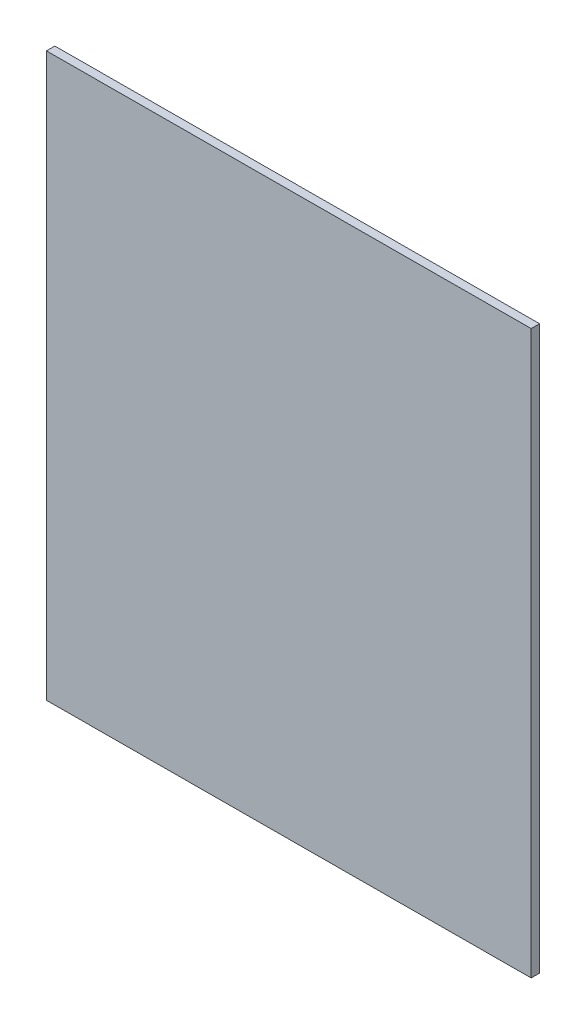
ISO-10303-21;
HEADER;
FILE_DESCRIPTION(('STEP AP214'),'2;1');
FILE_NAME('part.step','',(''),(''),'','','');
FILE_SCHEMA(('AUTOMOTIVE_DESIGN { 1 0 10303 214 1 1 1 1 }'));
ENDSEC;
DATA;
#1=APPLICATION_CONTEXT('core data for automotive mechanical design processes');
#2=APPLICATION_PROTOCOL_DEFINITION('international standard','automotive_design',2000,#1);
#3=PRODUCT_CONTEXT('',#1,'mechanical');
#4=PRODUCT('Part','Part','',(#3));
#5=PRODUCT_RELATED_PRODUCT_CATEGORY('part','',(#4));
#6=PRODUCT_DEFINITION_FORMATION('','',#4);
#7=PRODUCT_DEFINITION_CONTEXT('part definition',#1,'design');
#8=PRODUCT_DEFINITION('design','',#6,#7);
#9=PRODUCT_DEFINITION_SHAPE('','',#8);
#10=(LENGTH_UNIT() NAMED_UNIT(*) SI_UNIT(.MILLI.,.METRE.));
#11=(NAMED_UNIT(*) PLANE_ANGLE_UNIT() SI_UNIT($,.RADIAN.));
#12=(NAMED_UNIT(*) SI_UNIT($,.STERADIAN.) SOLID_ANGLE_UNIT());
#13=UNCERTAINTY_MEASURE_WITH_UNIT(LENGTH_MEASURE(1.E-05),#10,'distance_accuracy_value','');
#14=(GEOMETRIC_REPRESENTATION_CONTEXT(3) GLOBAL_UNCERTAINTY_ASSIGNED_CONTEXT((#13)) GLOBAL_UNIT_ASSIGNED_CONTEXT((#10,
#11,#12)) REPRESENTATION_CONTEXT('',''));
#15=CARTESIAN_POINT('',(0.,0.,0.));
#16=DIRECTION('',(0.,0.,1.));
#17=DIRECTION('',(1.,0.,0.));
#18=AXIS2_PLACEMENT_3D('',#15,#16,#17);
#19=CARTESIAN_POINT('',(-57.6000536662766,258.864031921605,-19.7746340834228));
#20=DIRECTION('',(0.,1.,0.));
#21=DIRECTION('',(0.,0.,1.));
#22=AXIS2_PLACEMENT_3D('',#19,#20,#21);
#23=PLANE('',#22);
#24=DIRECTION('',(0.999992480483627,0.,-0.00387801188796971));
#25=VECTOR('',#24,1.);
#26=CARTESIAN_POINT('',(-57.6078096900525,258.864031921605,-21.7746190443901));
#27=LINE('',#26,#25);
#28=CARTESIAN_POINT('',(-57.6078096900525,258.864031921605,-21.7746190443901));
#29=VERTEX_POINT('',#28);
#30=CARTESIAN_POINT('',(57.4371937720036,258.864031921605,-22.220768290294));
#31=VERTEX_POINT('',#30);
#32=EDGE_CURVE('E97',#29,#31,#27,.T.);
#33=ORIENTED_EDGE('',*,*,#32,.T.);
#34=DIRECTION('',(-0.00387801188796973,0.,-0.999992480483627));
#35=VECTOR('',#34,1.);
#36=CARTESIAN_POINT('',(57.4449497957795,258.864031921605,-20.2207833293267));
#37=LINE('',#36,#35);
#38=CARTESIAN_POINT('',(57.4449497957795,258.864031921605,-20.2207833293267));
#39=VERTEX_POINT('',#38);
#40=EDGE_CURVE('E11',#39,#31,#37,.T.);
#41=ORIENTED_EDGE('',*,*,#40,.F.);
#42=DIRECTION('',(0.999992480483627,0.,-0.00387801188796971));
#43=VECTOR('',#42,1.);
#44=CARTESIAN_POINT('',(-57.6000536662766,258.864031921605,-19.7746340834228));
#45=LINE('',#44,#43);
#46=CARTESIAN_POINT('',(-57.6000536662766,258.864031921605,-19.7746340834228));
#47=VERTEX_POINT('',#46);
#48=EDGE_CURVE('E85',#47,#39,#45,.T.);
#49=ORIENTED_EDGE('',*,*,#48,.F.);
#50=DIRECTION('',(-0.00387801188796973,0.,-0.999992480483627));
#51=VECTOR('',#50,1.);
#52=CARTESIAN_POINT('',(-57.6000536662766,258.864031921605,-19.7746340834228));
#53=LINE('',#52,#51);
#54=EDGE_CURVE('E93',#47,#29,#53,.T.);
#55=ORIENTED_EDGE('',*,*,#54,.T.);
#56=EDGE_LOOP('',(#33,#41,#49,#55));
#57=FACE_BOUND('',#56,.T.);
#58=ADVANCED_FACE('F34',(#57),#23,.F.);
#59=CARTESIAN_POINT('',(57.4449497957795,258.864031921605,-20.2207833293267));
#60=DIRECTION('',(-0.999992480483627,0.,0.00387801188796973));
#61=DIRECTION('',(0.00387801188796973,0.,0.999992480483627));
#62=AXIS2_PLACEMENT_3D('',#59,#60,#61);
#63=PLANE('',#62);
#64=DIRECTION('',(0.,1.,0.));
#65=VECTOR('',#64,1.);
#66=CARTESIAN_POINT('',(57.4371937720036,258.864031921605,-22.220768290294));
#67=LINE('',#66,#65);
#68=CARTESIAN_POINT('',(57.4371937720036,392.864031921605,-22.220768290294));
#69=VERTEX_POINT('',#68);
#70=EDGE_CURVE('E89',#31,#69,#67,.T.);
#71=ORIENTED_EDGE('',*,*,#70,.T.);
#72=DIRECTION('',(-0.00387801188796973,0.,-0.999992480483627));
#73=VECTOR('',#72,1.);
#74=CARTESIAN_POINT('',(57.4449497957795,392.864031921605,-20.2207833293267));
#75=LINE('',#74,#73);
#76=CARTESIAN_POINT('',(57.4449497957795,392.864031921605,-20.2207833293267));
#77=VERTEX_POINT('',#76);
#78=EDGE_CURVE('E42',#77,#69,#75,.T.);
#79=ORIENTED_EDGE('',*,*,#78,.F.);
#80=DIRECTION('',(0.,1.,0.));
#81=VECTOR('',#80,1.);
#82=CARTESIAN_POINT('',(57.4449497957795,258.864031921605,-20.2207833293267));
#83=LINE('',#82,#81);
#84=EDGE_CURVE('E80',#39,#77,#83,.T.);
#85=ORIENTED_EDGE('',*,*,#84,.F.);
#86=ORIENTED_EDGE('',*,*,#40,.T.);
#87=EDGE_LOOP('',(#71,#79,#85,#86));
#88=FACE_BOUND('',#87,.T.);
#89=ADVANCED_FACE('F88',(#88),#63,.F.);
#90=CARTESIAN_POINT('',(-57.6000536662766,392.864031921605,-19.7746340834228));
#91=DIRECTION('',(0.,-1.,0.));
#92=DIRECTION('',(0.,0.,-1.));
#93=AXIS2_PLACEMENT_3D('',#90,#91,#92);
#94=PLANE('',#93);
#95=DIRECTION('',(-0.999992480483627,0.,0.00387801188796971));
#96=VECTOR('',#95,1.);
#97=CARTESIAN_POINT('',(-57.6078096900525,392.864031921605,-21.7746190443901));
#98=LINE('',#97,#96);
#99=CARTESIAN_POINT('',(-57.6078096900525,392.864031921605,-21.7746190443901));
#100=VERTEX_POINT('',#99);
#101=EDGE_CURVE('E67',#69,#100,#98,.T.);
#102=ORIENTED_EDGE('',*,*,#101,.T.);
#103=DIRECTION('',(-0.00387801188796973,0.,-0.999992480483627));
#104=VECTOR('',#103,1.);
#105=CARTESIAN_POINT('',(-57.6000536662766,392.864031921605,-19.7746340834228));
#106=LINE('',#105,#104);
#107=CARTESIAN_POINT('',(-57.6000536662766,392.864031921605,-19.7746340834228));
#108=VERTEX_POINT('',#107);
#109=EDGE_CURVE('E90',#108,#100,#106,.T.);
#110=ORIENTED_EDGE('',*,*,#109,.F.);
#111=DIRECTION('',(-0.999992480483627,0.,0.00387801188796971));
#112=VECTOR('',#111,1.);
#113=CARTESIAN_POINT('',(-57.6000536662766,392.864031921605,-19.7746340834228));
#114=LINE('',#113,#112);
#115=EDGE_CURVE('E83',#77,#108,#114,.T.);
#116=ORIENTED_EDGE('',*,*,#115,.F.);
#117=ORIENTED_EDGE('',*,*,#78,.T.);
#118=EDGE_LOOP('',(#102,#110,#116,#117));
#119=FACE_BOUND('',#118,.T.);
#120=ADVANCED_FACE('F91',(#119),#94,.F.);
#121=CARTESIAN_POINT('',(-57.6000536662766,258.864031921605,-19.7746340834228));
#122=DIRECTION('',(0.999992480483627,0.,-0.00387801188796973));
#123=DIRECTION('',(-0.00387801188796973,0.,-0.999992480483627));
#124=AXIS2_PLACEMENT_3D('',#121,#122,#123);
#125=PLANE('',#124);
#126=DIRECTION('',(0.,-1.,0.));
#127=VECTOR('',#126,1.);
#128=CARTESIAN_POINT('',(-57.6078096900525,258.864031921605,-21.7746190443901));
#129=LINE('',#128,#127);
#130=EDGE_CURVE('E73',#100,#29,#129,.T.);
#131=ORIENTED_EDGE('',*,*,#130,.T.);
#132=ORIENTED_EDGE('',*,*,#54,.F.);
#133=DIRECTION('',(0.,-1.,0.));
#134=VECTOR('',#133,1.);
#135=CARTESIAN_POINT('',(-57.6000536662766,258.864031921605,-19.7746340834228));
#136=LINE('',#135,#134);
#137=EDGE_CURVE('E50',#108,#47,#136,.T.);
#138=ORIENTED_EDGE('',*,*,#137,.F.);
#139=ORIENTED_EDGE('',*,*,#109,.T.);
#140=EDGE_LOOP('',(#131,#132,#138,#139));
#141=FACE_BOUND('',#140,.T.);
#142=ADVANCED_FACE('F104',(#141),#125,.F.);
#143=CARTESIAN_POINT('',(-0.0775519352485235,0.,-19.9977087063748));
#144=DIRECTION('',(0.00387801188796971,0.,0.999992480483627));
#145=DIRECTION('',(0.999992480483627,0.,-0.00387801188796971));
#146=AXIS2_PLACEMENT_3D('',#143,#144,#145);
#147=PLANE('',#146);
#148=ORIENTED_EDGE('',*,*,#48,.T.);
#149=ORIENTED_EDGE('',*,*,#84,.T.);
#150=ORIENTED_EDGE('',*,*,#115,.T.);
#151=ORIENTED_EDGE('',*,*,#137,.T.);
#152=EDGE_LOOP('',(#148,#149,#150,#151));
#153=FACE_BOUND('',#152,.T.);
#154=ADVANCED_FACE('F81',(#153),#147,.T.);
#155=CARTESIAN_POINT('',(-0.085307959024463,0.,-21.997693667342));
#156=DIRECTION('',(0.00387801188796971,0.,0.999992480483627));
#157=DIRECTION('',(0.999992480483627,0.,-0.00387801188796971));
#158=AXIS2_PLACEMENT_3D('',#155,#156,#157);
#159=PLANE('',#158);
#160=ORIENTED_EDGE('',*,*,#32,.F.);
#161=ORIENTED_EDGE('',*,*,#130,.F.);
#162=ORIENTED_EDGE('',*,*,#101,.F.);
#163=ORIENTED_EDGE('',*,*,#70,.F.);
#164=EDGE_LOOP('',(#160,#161,#162,#163));
#165=FACE_BOUND('',#164,.T.);
#166=ADVANCED_FACE('F107',(#165),#159,.F.);
#167=CLOSED_SHELL('',(#58,#89,#120,#142,#154,#166));
#168=MANIFOLD_SOLID_BREP('B2',#167);
#169=ADVANCED_BREP_SHAPE_REPRESENTATION('',(#18,#168),#14);
#170=SHAPE_DEFINITION_REPRESENTATION(#9,#169);
ENDSEC;
END-ISO-10303-21;
